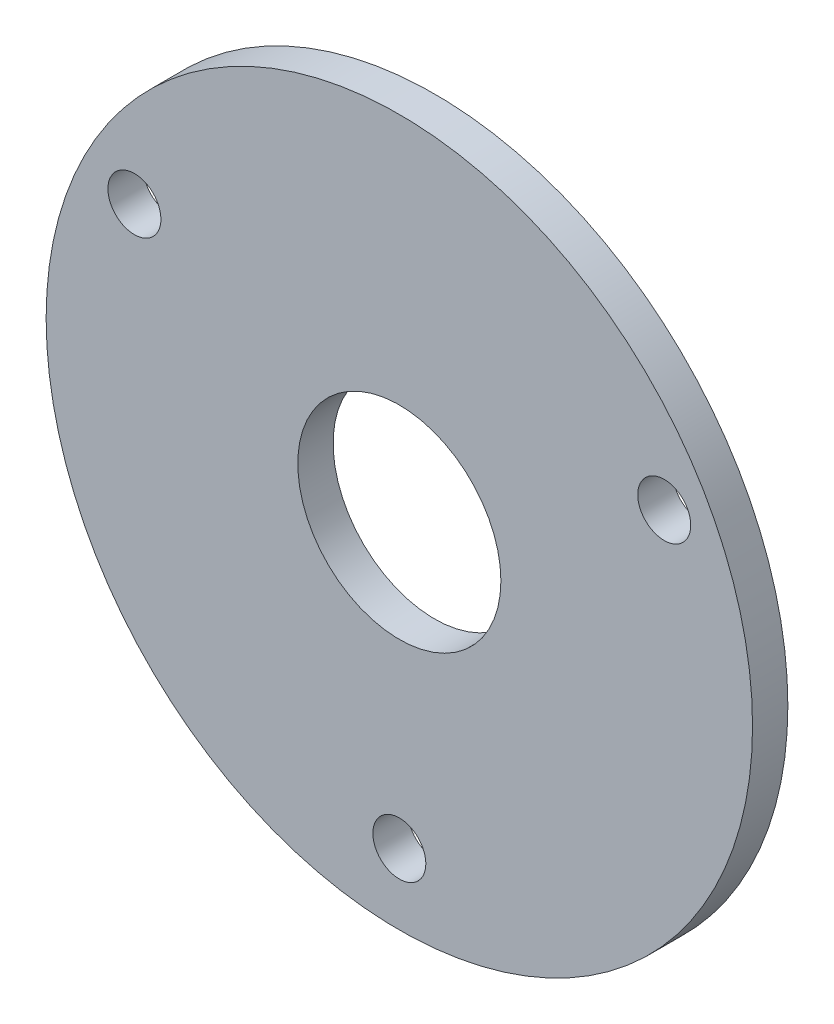
ISO-10303-21;
HEADER;
FILE_DESCRIPTION(('STEP AP214'),'2;1');
FILE_NAME('part.step','',(''),(''),'','','');
FILE_SCHEMA(('AUTOMOTIVE_DESIGN { 1 0 10303 214 1 1 1 1 }'));
ENDSEC;
DATA;
#1=APPLICATION_CONTEXT('core data for automotive mechanical design processes');
#2=APPLICATION_PROTOCOL_DEFINITION('international standard','automotive_design',2000,#1);
#3=PRODUCT_CONTEXT('',#1,'mechanical');
#4=PRODUCT('Part','Part','',(#3));
#5=PRODUCT_RELATED_PRODUCT_CATEGORY('part','',(#4));
#6=PRODUCT_DEFINITION_FORMATION('','',#4);
#7=PRODUCT_DEFINITION_CONTEXT('part definition',#1,'design');
#8=PRODUCT_DEFINITION('design','',#6,#7);
#9=PRODUCT_DEFINITION_SHAPE('','',#8);
#10=(LENGTH_UNIT() NAMED_UNIT(*) SI_UNIT(.MILLI.,.METRE.));
#11=(NAMED_UNIT(*) PLANE_ANGLE_UNIT() SI_UNIT($,.RADIAN.));
#12=(NAMED_UNIT(*) SI_UNIT($,.STERADIAN.) SOLID_ANGLE_UNIT());
#13=UNCERTAINTY_MEASURE_WITH_UNIT(LENGTH_MEASURE(1.E-05),#10,'distance_accuracy_value','');
#14=(GEOMETRIC_REPRESENTATION_CONTEXT(3) GLOBAL_UNCERTAINTY_ASSIGNED_CONTEXT((#13)) GLOBAL_UNIT_ASSIGNED_CONTEXT((#10,
#11,#12)) REPRESENTATION_CONTEXT('',''));
#15=CARTESIAN_POINT('',(0.,0.,0.));
#16=DIRECTION('',(0.,0.,1.));
#17=DIRECTION('',(1.,0.,0.));
#18=AXIS2_PLACEMENT_3D('',#15,#16,#17);
#19=CARTESIAN_POINT('',(0.,0.,2.));
#20=DIRECTION('',(0.,0.,1.));
#21=DIRECTION('',(1.,0.,0.));
#22=AXIS2_PLACEMENT_3D('',#19,#20,#21);
#23=PLANE('',#22);
#24=CARTESIAN_POINT('',(0.,0.,2.));
#25=DIRECTION('',(0.,0.,1.));
#26=DIRECTION('',(1.,0.,0.));
#27=AXIS2_PLACEMENT_3D('',#24,#25,#26);
#28=CIRCLE('',#27,5.75);
#29=CARTESIAN_POINT('',(5.75,0.,2.));
#30=VERTEX_POINT('',#29);
#31=EDGE_CURVE('E71',#30,#30,#28,.T.);
#32=ORIENTED_EDGE('',*,*,#31,.F.);
#33=EDGE_LOOP('',(#32));
#34=FACE_BOUND('',#33,.T.);
#35=CARTESIAN_POINT('',(0.,-16.,2.));
#36=DIRECTION('',(0.,0.,1.));
#37=DIRECTION('',(1.,0.,0.));
#38=AXIS2_PLACEMENT_3D('',#35,#36,#37);
#39=CIRCLE('',#38,1.5);
#40=CARTESIAN_POINT('',(1.5,-16.,2.));
#41=VERTEX_POINT('',#40);
#42=EDGE_CURVE('E57',#41,#41,#39,.T.);
#43=ORIENTED_EDGE('',*,*,#42,.F.);
#44=EDGE_LOOP('',(#43));
#45=FACE_BOUND('',#44,.T.);
#46=CARTESIAN_POINT('',(0.,0.,2.));
#47=DIRECTION('',(0.,0.,1.));
#48=DIRECTION('',(1.,0.,0.));
#49=AXIS2_PLACEMENT_3D('',#46,#47,#48);
#50=CIRCLE('',#49,20.);
#51=CARTESIAN_POINT('',(20.,0.,2.));
#52=VERTEX_POINT('',#51);
#53=EDGE_CURVE('E10',#52,#52,#50,.T.);
#54=ORIENTED_EDGE('',*,*,#53,.T.);
#55=EDGE_LOOP('',(#54));
#56=FACE_BOUND('',#55,.T.);
#57=CARTESIAN_POINT('',(15.,8.1,2.));
#58=DIRECTION('',(0.,0.,1.));
#59=DIRECTION('',(1.,0.,0.));
#60=AXIS2_PLACEMENT_3D('',#57,#58,#59);
#61=CIRCLE('',#60,1.5);
#62=CARTESIAN_POINT('',(16.5,8.1,2.));
#63=VERTEX_POINT('',#62);
#64=EDGE_CURVE('E52',#63,#63,#61,.T.);
#65=ORIENTED_EDGE('',*,*,#64,.F.);
#66=EDGE_LOOP('',(#65));
#67=FACE_BOUND('',#66,.T.);
#68=CARTESIAN_POINT('',(-15.,8.09999999999999,2.));
#69=DIRECTION('',(0.,0.,1.));
#70=DIRECTION('',(-1.,0.,0.));
#71=AXIS2_PLACEMENT_3D('',#68,#69,#70);
#72=CIRCLE('',#71,1.5);
#73=CARTESIAN_POINT('',(-16.5,8.09999999999999,2.));
#74=VERTEX_POINT('',#73);
#75=EDGE_CURVE('E63',#74,#74,#72,.T.);
#76=ORIENTED_EDGE('',*,*,#75,.F.);
#77=EDGE_LOOP('',(#76));
#78=FACE_BOUND('',#77,.T.);
#79=ADVANCED_FACE('F39',(#34,#45,#56,#67,#78),#23,.T.);
#80=CARTESIAN_POINT('',(0.,0.,0.));
#81=DIRECTION('',(0.,0.,1.));
#82=DIRECTION('',(1.,0.,0.));
#83=AXIS2_PLACEMENT_3D('',#80,#81,#82);
#84=PLANE('',#83);
#85=CARTESIAN_POINT('',(0.,0.,0.));
#86=DIRECTION('',(0.,0.,1.));
#87=DIRECTION('',(1.,0.,0.));
#88=AXIS2_PLACEMENT_3D('',#85,#86,#87);
#89=CIRCLE('',#88,5.75);
#90=CARTESIAN_POINT('',(5.75,0.,0.));
#91=VERTEX_POINT('',#90);
#92=EDGE_CURVE('E43',#91,#91,#89,.T.);
#93=ORIENTED_EDGE('',*,*,#92,.T.);
#94=EDGE_LOOP('',(#93));
#95=FACE_BOUND('',#94,.T.);
#96=CARTESIAN_POINT('',(0.,0.,0.));
#97=DIRECTION('',(0.,0.,1.));
#98=DIRECTION('',(1.,0.,0.));
#99=AXIS2_PLACEMENT_3D('',#96,#97,#98);
#100=CIRCLE('',#99,20.);
#101=CARTESIAN_POINT('',(20.,0.,0.));
#102=VERTEX_POINT('',#101);
#103=EDGE_CURVE('E47',#102,#102,#100,.T.);
#104=ORIENTED_EDGE('',*,*,#103,.F.);
#105=EDGE_LOOP('',(#104));
#106=FACE_BOUND('',#105,.T.);
#107=CARTESIAN_POINT('',(15.,8.1,0.));
#108=DIRECTION('',(0.,0.,1.));
#109=DIRECTION('',(1.,0.,0.));
#110=AXIS2_PLACEMENT_3D('',#107,#108,#109);
#111=CIRCLE('',#110,1.5);
#112=CARTESIAN_POINT('',(16.5,8.1,0.));
#113=VERTEX_POINT('',#112);
#114=EDGE_CURVE('E54',#113,#113,#111,.T.);
#115=ORIENTED_EDGE('',*,*,#114,.T.);
#116=EDGE_LOOP('',(#115));
#117=FACE_BOUND('',#116,.T.);
#118=CARTESIAN_POINT('',(0.,-16.,0.));
#119=DIRECTION('',(0.,0.,1.));
#120=DIRECTION('',(1.,0.,0.));
#121=AXIS2_PLACEMENT_3D('',#118,#119,#120);
#122=CIRCLE('',#121,1.5);
#123=CARTESIAN_POINT('',(1.5,-16.,0.));
#124=VERTEX_POINT('',#123);
#125=EDGE_CURVE('E60',#124,#124,#122,.T.);
#126=ORIENTED_EDGE('',*,*,#125,.T.);
#127=EDGE_LOOP('',(#126));
#128=FACE_BOUND('',#127,.T.);
#129=CARTESIAN_POINT('',(-15.,8.09999999999999,0.));
#130=DIRECTION('',(0.,0.,1.));
#131=DIRECTION('',(-1.,0.,0.));
#132=AXIS2_PLACEMENT_3D('',#129,#130,#131);
#133=CIRCLE('',#132,1.5);
#134=CARTESIAN_POINT('',(-16.5,8.09999999999999,0.));
#135=VERTEX_POINT('',#134);
#136=EDGE_CURVE('E66',#135,#135,#133,.T.);
#137=ORIENTED_EDGE('',*,*,#136,.T.);
#138=EDGE_LOOP('',(#137));
#139=FACE_BOUND('',#138,.T.);
#140=ADVANCED_FACE('F78',(#95,#106,#117,#128,#139),#84,.F.);
#141=CARTESIAN_POINT('',(0.,0.,2.));
#142=DIRECTION('',(0.,0.,-1.));
#143=DIRECTION('',(-1.,0.,0.));
#144=AXIS2_PLACEMENT_3D('',#141,#142,#143);
#145=CYLINDRICAL_SURFACE('',#144,20.);
#146=ORIENTED_EDGE('',*,*,#53,.F.);
#147=EDGE_LOOP('',(#146));
#148=FACE_BOUND('',#147,.T.);
#149=ORIENTED_EDGE('',*,*,#103,.T.);
#150=EDGE_LOOP('',(#149));
#151=FACE_BOUND('',#150,.T.);
#152=ADVANCED_FACE('F41',(#148,#151),#145,.T.);
#153=CARTESIAN_POINT('',(15.,8.1,2.));
#154=DIRECTION('',(0.,0.,-1.));
#155=DIRECTION('',(-1.,0.,0.));
#156=AXIS2_PLACEMENT_3D('',#153,#154,#155);
#157=CYLINDRICAL_SURFACE('',#156,1.5);
#158=ORIENTED_EDGE('',*,*,#64,.T.);
#159=EDGE_LOOP('',(#158));
#160=FACE_BOUND('',#159,.T.);
#161=ORIENTED_EDGE('',*,*,#114,.F.);
#162=EDGE_LOOP('',(#161));
#163=FACE_BOUND('',#162,.T.);
#164=ADVANCED_FACE('F99',(#160,#163),#157,.F.);
#165=CARTESIAN_POINT('',(0.,-16.,2.));
#166=DIRECTION('',(0.,0.,-1.));
#167=DIRECTION('',(-1.,0.,0.));
#168=AXIS2_PLACEMENT_3D('',#165,#166,#167);
#169=CYLINDRICAL_SURFACE('',#168,1.5);
#170=ORIENTED_EDGE('',*,*,#42,.T.);
#171=EDGE_LOOP('',(#170));
#172=FACE_BOUND('',#171,.T.);
#173=ORIENTED_EDGE('',*,*,#125,.F.);
#174=EDGE_LOOP('',(#173));
#175=FACE_BOUND('',#174,.T.);
#176=ADVANCED_FACE('F89',(#172,#175),#169,.F.);
#177=CARTESIAN_POINT('',(-15.,8.09999999999999,2.));
#178=DIRECTION('',(0.,0.,-1.));
#179=DIRECTION('',(-1.,0.,0.));
#180=AXIS2_PLACEMENT_3D('',#177,#178,#179);
#181=CYLINDRICAL_SURFACE('',#180,1.5);
#182=ORIENTED_EDGE('',*,*,#75,.T.);
#183=EDGE_LOOP('',(#182));
#184=FACE_BOUND('',#183,.T.);
#185=ORIENTED_EDGE('',*,*,#136,.F.);
#186=EDGE_LOOP('',(#185));
#187=FACE_BOUND('',#186,.T.);
#188=ADVANCED_FACE('F83',(#184,#187),#181,.F.);
#189=CARTESIAN_POINT('',(0.,0.,-8.));
#190=DIRECTION('',(0.,0.,1.));
#191=DIRECTION('',(1.,0.,0.));
#192=AXIS2_PLACEMENT_3D('',#189,#190,#191);
#193=CYLINDRICAL_SURFACE('',#192,5.75);
#194=ORIENTED_EDGE('',*,*,#31,.T.);
#195=EDGE_LOOP('',(#194));
#196=FACE_BOUND('',#195,.T.);
#197=ORIENTED_EDGE('',*,*,#92,.F.);
#198=EDGE_LOOP('',(#197));
#199=FACE_BOUND('',#198,.T.);
#200=ADVANCED_FACE('F81',(#196,#199),#193,.F.);
#201=CLOSED_SHELL('',(#79,#140,#152,#164,#176,#188,#200));
#202=MANIFOLD_SOLID_BREP('B2',#201);
#203=ADVANCED_BREP_SHAPE_REPRESENTATION('',(#18,#202),#14);
#204=SHAPE_DEFINITION_REPRESENTATION(#9,#203);
ENDSEC;
END-ISO-10303-21;
